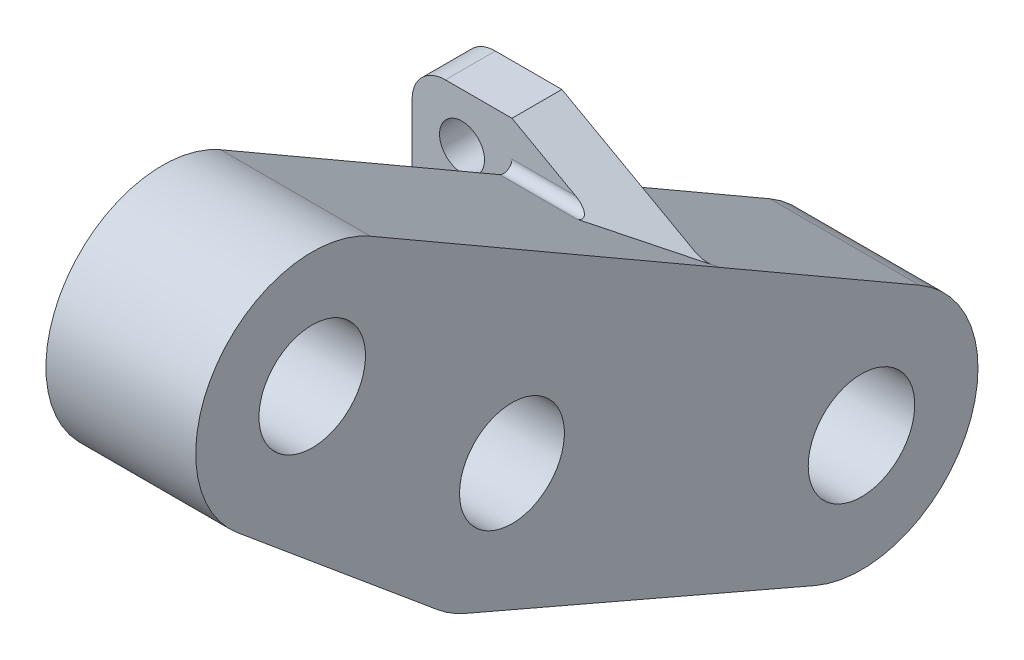
ISO-10303-21;
HEADER;
FILE_DESCRIPTION(('STEP AP214'),'2;1');
FILE_NAME('part.step','',(''),(''),'','','');
FILE_SCHEMA(('AUTOMOTIVE_DESIGN { 1 0 10303 214 1 1 1 1 }'));
ENDSEC;
DATA;
#1=APPLICATION_CONTEXT('core data for automotive mechanical design processes');
#2=APPLICATION_PROTOCOL_DEFINITION('international standard','automotive_design',2000,#1);
#3=PRODUCT_CONTEXT('',#1,'mechanical');
#4=PRODUCT('Part','Part','',(#3));
#5=PRODUCT_RELATED_PRODUCT_CATEGORY('part','',(#4));
#6=PRODUCT_DEFINITION_FORMATION('','',#4);
#7=PRODUCT_DEFINITION_CONTEXT('part definition',#1,'design');
#8=PRODUCT_DEFINITION('design','',#6,#7);
#9=PRODUCT_DEFINITION_SHAPE('','',#8);
#10=(LENGTH_UNIT() NAMED_UNIT(*) SI_UNIT(.MILLI.,.METRE.));
#11=(NAMED_UNIT(*) PLANE_ANGLE_UNIT() SI_UNIT($,.RADIAN.));
#12=(NAMED_UNIT(*) SI_UNIT($,.STERADIAN.) SOLID_ANGLE_UNIT());
#13=UNCERTAINTY_MEASURE_WITH_UNIT(LENGTH_MEASURE(1.E-05),#10,'distance_accuracy_value','');
#14=(GEOMETRIC_REPRESENTATION_CONTEXT(3) GLOBAL_UNCERTAINTY_ASSIGNED_CONTEXT((#13)) GLOBAL_UNIT_ASSIGNED_CONTEXT((#10,
#11,#12)) REPRESENTATION_CONTEXT('',''));
#15=CARTESIAN_POINT('',(0.,0.,0.));
#16=DIRECTION('',(0.,0.,1.));
#17=DIRECTION('',(1.,0.,0.));
#18=AXIS2_PLACEMENT_3D('',#15,#16,#17);
#19=CARTESIAN_POINT('',(0.,220.170630858978,-3.52352146744068));
#20=DIRECTION('',(0.,0.866046289310678,-0.499963823462463));
#21=DIRECTION('',(0.,0.499963823462463,0.866046289310678));
#22=AXIS2_PLACEMENT_3D('',#19,#20,#21);
#23=PLANE('',#22);
#24=DIRECTION('',(-0.668937989077525,0.37163221615418,0.643747980723241));
#25=VECTOR('',#24,1.);
#26=CARTESIAN_POINT('',(11.872490774869,225.512478625542,5.72972290583605));
#27=LINE('',#26,#25);
#28=CARTESIAN_POINT('',(4.60223241258734,229.551511049032,12.7262072085277));
#29=VERTEX_POINT('',#28);
#30=CARTESIAN_POINT('',(8.75875334381253,227.242332753907,8.72620720852774));
#31=VERTEX_POINT('',#30);
#32=EDGE_CURVE('E200',#29,#31,#27,.F.);
#33=ORIENTED_EDGE('',*,*,#32,.F.);
#34=DIRECTION('',(1.,0.,0.));
#35=VECTOR('',#34,1.);
#36=CARTESIAN_POINT('',(0.,229.551511049032,12.7262072085277));
#37=LINE('',#36,#35);
#38=CARTESIAN_POINT('',(0.,229.551511049032,12.7262072085277));
#39=VERTEX_POINT('',#38);
#40=EDGE_CURVE('E220',#29,#39,#37,.F.);
#41=ORIENTED_EDGE('',*,*,#40,.T.);
#42=DIRECTION('',(0.,0.499963823462463,0.866046289310678));
#43=VECTOR('',#42,1.);
#44=CARTESIAN_POINT('',(0.,220.170630858978,-3.52352146744068));
#45=LINE('',#44,#43);
#46=CARTESIAN_POINT('',(0.,239.221811231012,29.4772743779963));
#47=VERTEX_POINT('',#46);
#48=EDGE_CURVE('E285',#39,#47,#45,.T.);
#49=ORIENTED_EDGE('',*,*,#48,.T.);
#50=DIRECTION('',(1.,0.,0.));
#51=VECTOR('',#50,1.);
#52=CARTESIAN_POINT('',(0.,239.221811231012,29.4772743779963));
#53=LINE('',#52,#51);
#54=CARTESIAN_POINT('',(9.,239.221811231012,29.4772743779963));
#55=VERTEX_POINT('',#54);
#56=EDGE_CURVE('E325',#47,#55,#53,.T.);
#57=ORIENTED_EDGE('',*,*,#56,.T.);
#58=DIRECTION('',(0.,0.499963823462463,0.866046289310678));
#59=VECTOR('',#58,1.);
#60=CARTESIAN_POINT('',(9.,220.170630858978,-3.52352146744068));
#61=LINE('',#60,#59);
#62=CARTESIAN_POINT('',(9.,227.108306833803,8.49404510933065));
#63=VERTEX_POINT('',#62);
#64=EDGE_CURVE('E301',#63,#55,#61,.T.);
#65=ORIENTED_EDGE('',*,*,#64,.F.);
#66=EDGE_CURVE('E199',#31,#63,#27,.F.);
#67=ORIENTED_EDGE('',*,*,#66,.F.);
#68=EDGE_LOOP('',(#33,#41,#49,#57,#65,#67));
#69=FACE_BOUND('',#68,.T.);
#70=ADVANCED_FACE('F33',(#69),#23,.T.);
#71=CARTESIAN_POINT('',(0.,214.108306833803,-0.023774703203491));
#72=DIRECTION('',(1.,0.,0.));
#73=DIRECTION('',(0.,0.,-1.));
#74=AXIS2_PLACEMENT_3D('',#71,#72,#73);
#75=PLANE('',#74);
#76=CARTESIAN_POINT('',(0.,233.159487205837,32.9770211422335));
#77=DIRECTION('',(1.,0.,0.));
#78=DIRECTION('',(0.,0.,1.));
#79=AXIS2_PLACEMENT_3D('',#76,#77,#78);
#80=CIRCLE('',#79,3.20000000000002);
#81=CARTESIAN_POINT('',(0.,233.159487205837,36.1770211422335));
#82=VERTEX_POINT('',#81);
#83=EDGE_CURVE('E376',#82,#82,#80,.T.);
#84=ORIENTED_EDGE('',*,*,#83,.T.);
#85=EDGE_LOOP('',(#84));
#86=FACE_BOUND('',#85,.T.);
#87=CARTESIAN_POINT('',(0.,223.159487205837,20.9766034061269));
#88=DIRECTION('',(1.,0.,0.));
#89=DIRECTION('',(0.,0.,1.));
#90=AXIS2_PLACEMENT_3D('',#87,#88,#89);
#91=CIRCLE('',#90,3.15000000000003);
#92=CARTESIAN_POINT('',(0.,223.159487205837,24.1266034061269));
#93=VERTEX_POINT('',#92);
#94=EDGE_CURVE('E370',#93,#93,#91,.T.);
#95=ORIENTED_EDGE('',*,*,#94,.T.);
#96=EDGE_LOOP('',(#95));
#97=FACE_BOUND('',#96,.T.);
#98=ORIENTED_EDGE('',*,*,#48,.F.);
#99=CARTESIAN_POINT('',(0.,229.984534193687,12.4762252967965));
#100=DIRECTION('',(1.,0.,0.));
#101=DIRECTION('',(0.,0.,-1.));
#102=AXIS2_PLACEMENT_3D('',#99,#100,#101);
#103=CIRCLE('',#102,0.5);
#104=CARTESIAN_POINT('',(0.,229.984534193687,11.9762252967965));
#105=VERTEX_POINT('',#104);
#106=EDGE_CURVE('E172',#39,#105,#103,.T.);
#107=ORIENTED_EDGE('',*,*,#106,.T.);
#108=DIRECTION('',(0.,-1.,0.));
#109=VECTOR('',#108,1.);
#110=CARTESIAN_POINT('',(0.,214.108306833803,11.9762252967965));
#111=LINE('',#110,#109);
#112=CARTESIAN_POINT('',(0.,211.657828734491,11.9762252967965));
#113=VERTEX_POINT('',#112);
#114=EDGE_CURVE('E156',#105,#113,#111,.T.);
#115=ORIENTED_EDGE('',*,*,#114,.T.);
#116=DIRECTION('',(0.,-0.39580328417918,-0.918335320148896));
#117=VECTOR('',#116,1.);
#118=CARTESIAN_POINT('',(0.,216.731139964795,23.7472263953811));
#119=LINE('',#118,#117);
#120=CARTESIAN_POINT('',(0.,216.731139964795,23.7472263953811));
#121=VERTEX_POINT('',#120);
#122=EDGE_CURVE('E170',#121,#113,#119,.T.);
#123=ORIENTED_EDGE('',*,*,#122,.F.);
#124=CARTESIAN_POINT('',(0.,223.159487205837,20.9766034061269));
#125=DIRECTION('',(1.,0.,0.));
#126=DIRECTION('',(0.,0.,-1.));
#127=AXIS2_PLACEMENT_3D('',#124,#125,#126);
#128=CIRCLE('',#127,6.99999999999991);
#129=CARTESIAN_POINT('',(0.,217.781861529833,25.4578021395881));
#130=VERTEX_POINT('',#129);
#131=EDGE_CURVE('E296',#130,#121,#128,.T.);
#132=ORIENTED_EDGE('',*,*,#131,.F.);
#133=DIRECTION('',(0.,-0.640171247637326,-0.768232239429243));
#134=VECTOR('',#133,1.);
#135=CARTESIAN_POINT('',(0.,227.781861529833,37.4582198756947));
#136=LINE('',#135,#134);
#137=CARTESIAN_POINT('',(0.,227.781861529833,37.4582198756947));
#138=VERTEX_POINT('',#137);
#139=EDGE_CURVE('E288',#138,#130,#136,.T.);
#140=ORIENTED_EDGE('',*,*,#139,.F.);
#141=CARTESIAN_POINT('',(0.,233.159487205837,32.9770211422335));
#142=DIRECTION('',(1.,0.,0.));
#143=DIRECTION('',(0.,0.,-1.));
#144=AXIS2_PLACEMENT_3D('',#141,#142,#143);
#145=CIRCLE('',#144,6.99999999999992);
#146=EDGE_CURVE('E284',#47,#138,#145,.T.);
#147=ORIENTED_EDGE('',*,*,#146,.F.);
#148=EDGE_LOOP('',(#98,#107,#115,#123,#132,#140,#147));
#149=FACE_BOUND('',#148,.T.);
#150=ADVANCED_FACE('F168',(#86,#97,#149),#75,.F.);
#151=CARTESIAN_POINT('',(0.,214.108306833803,-0.023774703203491));
#152=DIRECTION('',(1.,0.,0.));
#153=DIRECTION('',(0.,0.,-1.));
#154=AXIS2_PLACEMENT_3D('',#151,#152,#153);
#155=CYLINDRICAL_SURFACE('',#154,6.99999999999988);
#156=CARTESIAN_POINT('',(9.,214.108306833803,-0.023774703203491));
#157=DIRECTION('',(1.,0.,0.));
#158=DIRECTION('',(0.,0.,-1.));
#159=AXIS2_PLACEMENT_3D('',#156,#157,#158);
#160=CIRCLE('',#159,6.99999999999988);
#161=CARTESIAN_POINT('',(9.,207.679959592761,2.74684828605071));
#162=VERTEX_POINT('',#161);
#163=CARTESIAN_POINT('',(9.,220.170630858978,-3.52352146744068));
#164=VERTEX_POINT('',#163);
#165=EDGE_CURVE('E298',#162,#164,#160,.T.);
#166=ORIENTED_EDGE('',*,*,#165,.F.);
#167=DIRECTION('',(1.,0.,0.));
#168=VECTOR('',#167,1.);
#169=CARTESIAN_POINT('',(0.,207.679959592761,2.74684828605071));
#170=LINE('',#169,#168);
#171=CARTESIAN_POINT('',(0.,207.679959592761,2.74684828605071));
#172=VERTEX_POINT('',#171);
#173=EDGE_CURVE('E317',#172,#162,#170,.T.);
#174=ORIENTED_EDGE('',*,*,#173,.F.);
#175=CARTESIAN_POINT('',(0.,214.108306833803,-0.023774703203491));
#176=DIRECTION('',(1.,0.,0.));
#177=DIRECTION('',(0.,0.,-1.));
#178=AXIS2_PLACEMENT_3D('',#175,#176,#177);
#179=CIRCLE('',#178,6.99999999999988);
#180=CARTESIAN_POINT('',(0.,220.170630858978,-3.52352146744068));
#181=VERTEX_POINT('',#180);
#182=EDGE_CURVE('E290',#172,#181,#179,.T.);
#183=ORIENTED_EDGE('',*,*,#182,.T.);
#184=DIRECTION('',(1.,0.,0.));
#185=VECTOR('',#184,1.);
#186=CARTESIAN_POINT('',(0.,220.170630858978,-3.52352146744068));
#187=LINE('',#186,#185);
#188=EDGE_CURVE('E181',#181,#164,#187,.T.);
#189=ORIENTED_EDGE('',*,*,#188,.T.);
#190=EDGE_LOOP('',(#166,#174,#183,#189));
#191=FACE_BOUND('',#190,.T.);
#192=ADVANCED_FACE('F257',(#191),#155,.T.);
#193=CARTESIAN_POINT('',(0.,216.731139964795,23.7472263953811));
#194=DIRECTION('',(0.,-0.918335320148896,0.39580328417918));
#195=DIRECTION('',(0.,-0.39580328417918,-0.918335320148896));
#196=AXIS2_PLACEMENT_3D('',#193,#194,#195);
#197=PLANE('',#196);
#198=ORIENTED_EDGE('',*,*,#122,.T.);
#199=DIRECTION('',(0.,-0.39580328417918,-0.918335320148896));
#200=VECTOR('',#199,1.);
#201=CARTESIAN_POINT('',(0.,216.731139964795,23.7472263953811));
#202=LINE('',#201,#200);
#203=CARTESIAN_POINT('',(0.,209.933825418948,7.97622529679652));
#204=VERTEX_POINT('',#203);
#205=EDGE_CURVE('E49',#113,#204,#202,.T.);
#206=ORIENTED_EDGE('',*,*,#205,.T.);
#207=EDGE_CURVE('E182',#204,#172,#119,.T.);
#208=ORIENTED_EDGE('',*,*,#207,.T.);
#209=ORIENTED_EDGE('',*,*,#173,.T.);
#210=DIRECTION('',(0.,-0.39580328417918,-0.918335320148896));
#211=VECTOR('',#210,1.);
#212=CARTESIAN_POINT('',(9.,216.731139964795,23.7472263953811));
#213=LINE('',#212,#211);
#214=CARTESIAN_POINT('',(9.,216.731139964795,23.7472263953811));
#215=VERTEX_POINT('',#214);
#216=EDGE_CURVE('E315',#215,#162,#213,.T.);
#217=ORIENTED_EDGE('',*,*,#216,.F.);
#218=DIRECTION('',(1.,0.,0.));
#219=VECTOR('',#218,1.);
#220=CARTESIAN_POINT('',(0.,216.731139964795,23.7472263953811));
#221=LINE('',#220,#219);
#222=EDGE_CURVE('E179',#121,#215,#221,.T.);
#223=ORIENTED_EDGE('',*,*,#222,.F.);
#224=EDGE_LOOP('',(#198,#206,#208,#209,#217,#223));
#225=FACE_BOUND('',#224,.T.);
#226=ADVANCED_FACE('F177',(#225),#197,.T.);
#227=CARTESIAN_POINT('',(0.,223.159487205837,20.9766034061269));
#228=DIRECTION('',(1.,0.,0.));
#229=DIRECTION('',(0.,0.,-1.));
#230=AXIS2_PLACEMENT_3D('',#227,#228,#229);
#231=CYLINDRICAL_SURFACE('',#230,6.99999999999991);
#232=CARTESIAN_POINT('',(9.,223.159487205837,20.9766034061269));
#233=DIRECTION('',(1.,0.,0.));
#234=DIRECTION('',(0.,0.,-1.));
#235=AXIS2_PLACEMENT_3D('',#232,#233,#234);
#236=CIRCLE('',#235,6.99999999999991);
#237=CARTESIAN_POINT('',(9.,217.781861529833,25.4578021395881));
#238=VERTEX_POINT('',#237);
#239=EDGE_CURVE('E312',#238,#215,#236,.T.);
#240=ORIENTED_EDGE('',*,*,#239,.F.);
#241=DIRECTION('',(1.,0.,0.));
#242=VECTOR('',#241,1.);
#243=CARTESIAN_POINT('',(0.,217.781861529833,25.4578021395881));
#244=LINE('',#243,#242);
#245=EDGE_CURVE('E321',#130,#238,#244,.T.);
#246=ORIENTED_EDGE('',*,*,#245,.F.);
#247=ORIENTED_EDGE('',*,*,#131,.T.);
#248=ORIENTED_EDGE('',*,*,#222,.T.);
#249=EDGE_LOOP('',(#240,#246,#247,#248));
#250=FACE_BOUND('',#249,.T.);
#251=ADVANCED_FACE('F344',(#250),#231,.T.);
#252=CARTESIAN_POINT('',(0.,227.781861529833,37.4582198756947));
#253=DIRECTION('',(0.,-0.768232239429243,0.640171247637326));
#254=DIRECTION('',(0.,-0.640171247637326,-0.768232239429243));
#255=AXIS2_PLACEMENT_3D('',#252,#253,#254);
#256=PLANE('',#255);
#257=DIRECTION('',(0.,-0.640171247637326,-0.768232239429243));
#258=VECTOR('',#257,1.);
#259=CARTESIAN_POINT('',(9.,227.781861529833,37.4582198756947));
#260=LINE('',#259,#258);
#261=CARTESIAN_POINT('',(9.,227.781861529833,37.4582198756947));
#262=VERTEX_POINT('',#261);
#263=EDGE_CURVE('E309',#262,#238,#260,.T.);
#264=ORIENTED_EDGE('',*,*,#263,.F.);
#265=DIRECTION('',(1.,0.,0.));
#266=VECTOR('',#265,1.);
#267=CARTESIAN_POINT('',(0.,227.781861529833,37.4582198756947));
#268=LINE('',#267,#266);
#269=EDGE_CURVE('E323',#138,#262,#268,.T.);
#270=ORIENTED_EDGE('',*,*,#269,.F.);
#271=ORIENTED_EDGE('',*,*,#139,.T.);
#272=ORIENTED_EDGE('',*,*,#245,.T.);
#273=EDGE_LOOP('',(#264,#270,#271,#272));
#274=FACE_BOUND('',#273,.T.);
#275=ADVANCED_FACE('F274',(#274),#256,.T.);
#276=CARTESIAN_POINT('',(0.,233.159487205837,32.9770211422335));
#277=DIRECTION('',(1.,0.,0.));
#278=DIRECTION('',(0.,0.,-1.));
#279=AXIS2_PLACEMENT_3D('',#276,#277,#278);
#280=CYLINDRICAL_SURFACE('',#279,6.99999999999992);
#281=CARTESIAN_POINT('',(9.,233.159487205837,32.9770211422335));
#282=DIRECTION('',(1.,0.,0.));
#283=DIRECTION('',(0.,0.,-1.));
#284=AXIS2_PLACEMENT_3D('',#281,#282,#283);
#285=CIRCLE('',#284,6.99999999999992);
#286=EDGE_CURVE('E306',#55,#262,#285,.T.);
#287=ORIENTED_EDGE('',*,*,#286,.F.);
#288=ORIENTED_EDGE('',*,*,#56,.F.);
#289=ORIENTED_EDGE('',*,*,#146,.T.);
#290=ORIENTED_EDGE('',*,*,#269,.T.);
#291=EDGE_LOOP('',(#287,#288,#289,#290));
#292=FACE_BOUND('',#291,.T.);
#293=ADVANCED_FACE('F264',(#292),#280,.T.);
#294=CARTESIAN_POINT('',(0.,226.80937226583,7.97622529679651));
#295=VERTEX_POINT('',#294);
#296=EDGE_CURVE('E278',#181,#295,#45,.T.);
#297=ORIENTED_EDGE('',*,*,#296,.T.);
#298=CARTESIAN_POINT('',(-1.,226.80937226583,7.97622529679651));
#299=DIRECTION('',(0.,0.866046289310678,-0.499963823462463));
#300=DIRECTION('',(0.,0.499963823462463,0.866046289310678));
#301=AXIS2_PLACEMENT_3D('',#298,#299,#300);
#302=ELLIPSE('',#301,1.1546726916825,1.);
#303=CARTESIAN_POINT('',(-0.338541662630233,227.242332753907,8.72620720852774));
#304=VERTEX_POINT('',#303);
#305=EDGE_CURVE('E231',#295,#304,#302,.F.);
#306=ORIENTED_EDGE('',*,*,#305,.T.);
#307=DIRECTION('',(-1.,0.,0.));
#308=VECTOR('',#307,1.);
#309=CARTESIAN_POINT('',(8.49895198954403,227.242332753907,8.72620720852774));
#310=LINE('',#309,#308);
#311=EDGE_CURVE('E57',#304,#31,#310,.F.);
#312=ORIENTED_EDGE('',*,*,#311,.T.);
#313=ORIENTED_EDGE('',*,*,#66,.T.);
#314=EDGE_CURVE('E303',#164,#63,#61,.T.);
#315=ORIENTED_EDGE('',*,*,#314,.F.);
#316=ORIENTED_EDGE('',*,*,#188,.F.);
#317=EDGE_LOOP('',(#297,#306,#312,#313,#315,#316));
#318=FACE_BOUND('',#317,.T.);
#319=ADVANCED_FACE('F252',(#318),#23,.T.);
#320=CARTESIAN_POINT('',(0.,214.108306833803,-0.023774703203491));
#321=DIRECTION('',(1.,0.,0.));
#322=DIRECTION('',(0.,0.,1.));
#323=AXIS2_PLACEMENT_3D('',#320,#321,#322);
#324=CIRCLE('',#323,3.20000000000001);
#325=CARTESIAN_POINT('',(0.,214.108306833803,3.17622529679652));
#326=VERTEX_POINT('',#325);
#327=EDGE_CURVE('E302',#326,#326,#324,.T.);
#328=ORIENTED_EDGE('',*,*,#327,.T.);
#329=EDGE_LOOP('',(#328));
#330=FACE_BOUND('',#329,.T.);
#331=ORIENTED_EDGE('',*,*,#207,.F.);
#332=DIRECTION('',(0.,1.,0.));
#333=VECTOR('',#332,1.);
#334=CARTESIAN_POINT('',(0.,214.108306833803,7.97622529679651));
#335=LINE('',#334,#333);
#336=EDGE_CURVE('E226',#204,#295,#335,.T.);
#337=ORIENTED_EDGE('',*,*,#336,.T.);
#338=ORIENTED_EDGE('',*,*,#296,.F.);
#339=ORIENTED_EDGE('',*,*,#182,.F.);
#340=EDGE_LOOP('',(#331,#337,#338,#339));
#341=FACE_BOUND('',#340,.T.);
#342=ADVANCED_FACE('F260',(#330,#341),#75,.F.);
#343=CARTESIAN_POINT('',(9.,214.108306833803,-0.023774703203491));
#344=DIRECTION('',(1.,0.,0.));
#345=DIRECTION('',(0.,0.,-1.));
#346=AXIS2_PLACEMENT_3D('',#343,#344,#345);
#347=PLANE('',#346);
#348=ORIENTED_EDGE('',*,*,#314,.T.);
#349=ORIENTED_EDGE('',*,*,#64,.T.);
#350=ORIENTED_EDGE('',*,*,#286,.T.);
#351=ORIENTED_EDGE('',*,*,#263,.T.);
#352=ORIENTED_EDGE('',*,*,#239,.T.);
#353=ORIENTED_EDGE('',*,*,#216,.T.);
#354=ORIENTED_EDGE('',*,*,#165,.T.);
#355=EDGE_LOOP('',(#348,#349,#350,#351,#352,#353,#354));
#356=FACE_BOUND('',#355,.T.);
#357=CARTESIAN_POINT('',(9.,214.108306833803,-0.023774703203491));
#358=DIRECTION('',(1.,0.,0.));
#359=DIRECTION('',(0.,0.,1.));
#360=AXIS2_PLACEMENT_3D('',#357,#358,#359);
#361=CIRCLE('',#360,3.20000000000001);
#362=CARTESIAN_POINT('',(9.,214.108306833803,3.17622529679652));
#363=VERTEX_POINT('',#362);
#364=EDGE_CURVE('E379',#363,#363,#361,.T.);
#365=ORIENTED_EDGE('',*,*,#364,.F.);
#366=EDGE_LOOP('',(#365));
#367=FACE_BOUND('',#366,.T.);
#368=CARTESIAN_POINT('',(9.,233.159487205837,32.9770211422335));
#369=DIRECTION('',(1.,0.,0.));
#370=DIRECTION('',(0.,0.,1.));
#371=AXIS2_PLACEMENT_3D('',#368,#369,#370);
#372=CIRCLE('',#371,3.20000000000002);
#373=CARTESIAN_POINT('',(9.,233.159487205837,36.1770211422335));
#374=VERTEX_POINT('',#373);
#375=EDGE_CURVE('E373',#374,#374,#372,.T.);
#376=ORIENTED_EDGE('',*,*,#375,.F.);
#377=EDGE_LOOP('',(#376));
#378=FACE_BOUND('',#377,.T.);
#379=CARTESIAN_POINT('',(9.,223.159487205837,20.9766034061269));
#380=DIRECTION('',(1.,0.,0.));
#381=DIRECTION('',(0.,0.,1.));
#382=AXIS2_PLACEMENT_3D('',#379,#380,#381);
#383=CIRCLE('',#382,3.15000000000003);
#384=CARTESIAN_POINT('',(9.,223.159487205837,24.1266034061269));
#385=VERTEX_POINT('',#384);
#386=EDGE_CURVE('E174',#385,#385,#383,.T.);
#387=ORIENTED_EDGE('',*,*,#386,.F.);
#388=EDGE_LOOP('',(#387));
#389=FACE_BOUND('',#388,.T.);
#390=ADVANCED_FACE('F271',(#356,#367,#378,#389),#347,.T.);
#391=CARTESIAN_POINT('',(0.,214.108306833803,-0.023774703203491));
#392=DIRECTION('',(1.,0.,0.));
#393=DIRECTION('',(0.,0.,-1.));
#394=AXIS2_PLACEMENT_3D('',#391,#392,#393);
#395=CYLINDRICAL_SURFACE('',#394,3.20000000000001);
#396=ORIENTED_EDGE('',*,*,#327,.F.);
#397=EDGE_LOOP('',(#396));
#398=FACE_BOUND('',#397,.T.);
#399=ORIENTED_EDGE('',*,*,#364,.T.);
#400=EDGE_LOOP('',(#399));
#401=FACE_BOUND('',#400,.T.);
#402=ADVANCED_FACE('F386',(#398,#401),#395,.F.);
#403=CARTESIAN_POINT('',(0.,233.159487205837,32.9770211422335));
#404=DIRECTION('',(1.,0.,0.));
#405=DIRECTION('',(0.,0.,-1.));
#406=AXIS2_PLACEMENT_3D('',#403,#404,#405);
#407=CYLINDRICAL_SURFACE('',#406,3.20000000000002);
#408=ORIENTED_EDGE('',*,*,#83,.F.);
#409=EDGE_LOOP('',(#408));
#410=FACE_BOUND('',#409,.T.);
#411=ORIENTED_EDGE('',*,*,#375,.T.);
#412=EDGE_LOOP('',(#411));
#413=FACE_BOUND('',#412,.T.);
#414=ADVANCED_FACE('F395',(#410,#413),#407,.F.);
#415=CARTESIAN_POINT('',(0.,223.159487205837,20.9766034061269));
#416=DIRECTION('',(1.,0.,0.));
#417=DIRECTION('',(0.,0.,-1.));
#418=AXIS2_PLACEMENT_3D('',#415,#416,#417);
#419=CYLINDRICAL_SURFACE('',#418,3.15000000000003);
#420=ORIENTED_EDGE('',*,*,#94,.F.);
#421=EDGE_LOOP('',(#420));
#422=FACE_BOUND('',#421,.T.);
#423=ORIENTED_EDGE('',*,*,#386,.T.);
#424=EDGE_LOOP('',(#423));
#425=FACE_BOUND('',#424,.T.);
#426=ADVANCED_FACE('F394',(#422,#425),#419,.F.);
#427=CARTESIAN_POINT('',(30.9494635012435,232.108306833803,11.9762252967965));
#428=DIRECTION('',(0.,0.,1.));
#429=DIRECTION('',(0.,-1.,0.));
#430=AXIS2_PLACEMENT_3D('',#427,#428,#429);
#431=PLANE('',#430);
#432=CARTESIAN_POINT('',(-3.,229.108306833803,11.9762252967965));
#433=DIRECTION('',(0.,0.,1.));
#434=DIRECTION('',(0.,-1.,0.));
#435=AXIS2_PLACEMENT_3D('',#432,#433,#434);
#436=CIRCLE('',#435,1.34999999999999);
#437=CARTESIAN_POINT('',(-3.,227.758306833803,11.9762252967965));
#438=VERTEX_POINT('',#437);
#439=EDGE_CURVE('E573',#438,#438,#436,.T.);
#440=ORIENTED_EDGE('',*,*,#439,.F.);
#441=EDGE_LOOP('',(#440));
#442=FACE_BOUND('',#441,.T.);
#443=ORIENTED_EDGE('',*,*,#114,.F.);
#444=DIRECTION('',(1.,0.,0.));
#445=VECTOR('',#444,1.);
#446=CARTESIAN_POINT('',(5.38156129112513,229.984534193687,11.9762252967965));
#447=LINE('',#446,#445);
#448=CARTESIAN_POINT('',(3.8227907522077,229.984534193687,11.9762252967965));
#449=VERTEX_POINT('',#448);
#450=EDGE_CURVE('E218',#105,#449,#447,.T.);
#451=ORIENTED_EDGE('',*,*,#450,.T.);
#452=DIRECTION('',(0.874157276121538,-0.485642931178632,0.));
#453=VECTOR('',#452,1.);
#454=CARTESIAN_POINT('',(23.6500617320823,218.969383649313,11.9762252967965));
#455=LINE('',#454,#453);
#456=CARTESIAN_POINT('',(0.,232.108306833803,11.9762252967965));
#457=VERTEX_POINT('',#456);
#458=EDGE_CURVE('E202',#449,#457,#455,.F.);
#459=ORIENTED_EDGE('',*,*,#458,.T.);
#460=DIRECTION('',(-1.,0.,0.));
#461=VECTOR('',#460,1.);
#462=CARTESIAN_POINT('',(30.9494635012435,232.108306833803,11.9762252967965));
#463=LINE('',#462,#461);
#464=CARTESIAN_POINT('',(-4.,232.108306833803,11.9762252967965));
#465=VERTEX_POINT('',#464);
#466=EDGE_CURVE('E362',#457,#465,#463,.T.);
#467=ORIENTED_EDGE('',*,*,#466,.T.);
#468=CARTESIAN_POINT('',(-4.,230.108306833803,11.9762252967965));
#469=DIRECTION('',(0.,0.,1.));
#470=DIRECTION('',(0.,-1.,0.));
#471=AXIS2_PLACEMENT_3D('',#468,#469,#470);
#472=CIRCLE('',#471,2.);
#473=CARTESIAN_POINT('',(-6.,230.108306833803,11.9762252967965));
#474=VERTEX_POINT('',#473);
#475=EDGE_CURVE('E211',#465,#474,#472,.T.);
#476=ORIENTED_EDGE('',*,*,#475,.T.);
#477=DIRECTION('',(0.,1.,0.));
#478=VECTOR('',#477,1.);
#479=CARTESIAN_POINT('',(-6.,232.108306833803,11.9762252967965));
#480=LINE('',#479,#478);
#481=CARTESIAN_POINT('',(-5.99999999999999,222.547097371549,11.9762252967965));
#482=VERTEX_POINT('',#481);
#483=EDGE_CURVE('E159',#482,#474,#480,.T.);
#484=ORIENTED_EDGE('',*,*,#483,.F.);
#485=DIRECTION('',(-0.482591843188045,0.875845370421266,0.));
#486=VECTOR('',#485,1.);
#487=CARTESIAN_POINT('',(-1.43595103016961,214.263904820687,11.9762252967965));
#488=LINE('',#487,#486);
#489=EDGE_CURVE('E152',#482,#113,#488,.F.);
#490=ORIENTED_EDGE('',*,*,#489,.T.);
#491=EDGE_LOOP('',(#443,#451,#459,#467,#476,#484,#490));
#492=FACE_BOUND('',#491,.T.);
#493=ADVANCED_FACE('F154',(#442,#492),#431,.T.);
#494=CARTESIAN_POINT('',(30.9494635012435,232.108306833803,8.97622529679651));
#495=DIRECTION('',(0.,1.,0.));
#496=DIRECTION('',(0.,0.,1.));
#497=AXIS2_PLACEMENT_3D('',#494,#495,#496);
#498=PLANE('',#497);
#499=DIRECTION('',(-1.,0.,0.));
#500=VECTOR('',#499,1.);
#501=CARTESIAN_POINT('',(30.9494635012435,232.108306833803,8.97622529679651));
#502=LINE('',#501,#500);
#503=CARTESIAN_POINT('',(0.,232.108306833803,8.97622529679651));
#504=VERTEX_POINT('',#503);
#505=CARTESIAN_POINT('',(-4.,232.108306833803,8.97622529679651));
#506=VERTEX_POINT('',#505);
#507=EDGE_CURVE('E175',#504,#506,#502,.T.);
#508=ORIENTED_EDGE('',*,*,#507,.T.);
#509=DIRECTION('',(0.,0.,-1.));
#510=VECTOR('',#509,1.);
#511=CARTESIAN_POINT('',(-4.,232.108306833803,8.97622529679651));
#512=LINE('',#511,#510);
#513=EDGE_CURVE('E209',#506,#465,#512,.F.);
#514=ORIENTED_EDGE('',*,*,#513,.T.);
#515=ORIENTED_EDGE('',*,*,#466,.F.);
#516=DIRECTION('',(0.,0.,-1.));
#517=VECTOR('',#516,1.);
#518=CARTESIAN_POINT('',(0.,232.108306833803,8.97622529679651));
#519=LINE('',#518,#517);
#520=EDGE_CURVE('E190',#457,#504,#519,.T.);
#521=ORIENTED_EDGE('',*,*,#520,.T.);
#522=EDGE_LOOP('',(#508,#514,#515,#521));
#523=FACE_BOUND('',#522,.T.);
#524=ADVANCED_FACE('F360',(#523),#498,.T.);
#525=CARTESIAN_POINT('',(30.9494635012435,232.108306833803,8.97622529679651));
#526=DIRECTION('',(0.,0.,-1.));
#527=DIRECTION('',(0.,1.,0.));
#528=AXIS2_PLACEMENT_3D('',#525,#526,#527);
#529=PLANE('',#528);
#530=CARTESIAN_POINT('',(-3.,229.108306833803,8.97622529679651));
#531=DIRECTION('',(0.,0.,-1.));
#532=DIRECTION('',(0.,1.,0.));
#533=AXIS2_PLACEMENT_3D('',#530,#531,#532);
#534=CIRCLE('',#533,1.34999999999999);
#535=CARTESIAN_POINT('',(-3.,230.458306833803,8.97622529679651));
#536=VERTEX_POINT('',#535);
#537=EDGE_CURVE('E571',#536,#536,#534,.T.);
#538=ORIENTED_EDGE('',*,*,#537,.F.);
#539=EDGE_LOOP('',(#538));
#540=FACE_BOUND('',#539,.T.);
#541=DIRECTION('',(-1.,0.,0.));
#542=VECTOR('',#541,1.);
#543=CARTESIAN_POINT('',(0.,227.675355898562,8.97622529679651));
#544=LINE('',#543,#542);
#545=CARTESIAN_POINT('',(7.9793116834329,227.675355898562,8.97622529679651));
#546=VERTEX_POINT('',#545);
#547=CARTESIAN_POINT('',(-1.,227.675355898562,8.97622529679651));
#548=VERTEX_POINT('',#547);
#549=EDGE_CURVE('E213',#546,#548,#544,.T.);
#550=ORIENTED_EDGE('',*,*,#549,.T.);
#551=DIRECTION('',(0.,1.,0.));
#552=VECTOR('',#551,1.);
#553=CARTESIAN_POINT('',(-1.,232.108306833803,8.97622529679651));
#554=LINE('',#553,#552);
#555=CARTESIAN_POINT('',(-0.999999999999995,212.17970435401,8.97622529679651));
#556=VERTEX_POINT('',#555);
#557=EDGE_CURVE('E229',#548,#556,#554,.F.);
#558=ORIENTED_EDGE('',*,*,#557,.T.);
#559=DIRECTION('',(0.482591843188045,-0.875845370421266,0.));
#560=VECTOR('',#559,1.);
#561=CARTESIAN_POINT('',(-1.98247193155495,213.962771152522,8.97622529679651));
#562=LINE('',#561,#560);
#563=CARTESIAN_POINT('',(-5.99999999999999,221.254094884892,8.97622529679651));
#564=VERTEX_POINT('',#563);
#565=EDGE_CURVE('E188',#556,#564,#562,.F.);
#566=ORIENTED_EDGE('',*,*,#565,.T.);
#567=DIRECTION('',(0.,-1.,0.));
#568=VECTOR('',#567,1.);
#569=CARTESIAN_POINT('',(-6.,232.108306833803,8.97622529679651));
#570=LINE('',#569,#568);
#571=CARTESIAN_POINT('',(-6.,230.108306833803,8.97622529679651));
#572=VERTEX_POINT('',#571);
#573=EDGE_CURVE('E333',#572,#564,#570,.T.);
#574=ORIENTED_EDGE('',*,*,#573,.F.);
#575=CARTESIAN_POINT('',(-4.,230.108306833803,8.97622529679651));
#576=DIRECTION('',(0.,0.,-1.));
#577=DIRECTION('',(0.,1.,0.));
#578=AXIS2_PLACEMENT_3D('',#575,#576,#577);
#579=CIRCLE('',#578,2.);
#580=EDGE_CURVE('E207',#572,#506,#579,.T.);
#581=ORIENTED_EDGE('',*,*,#580,.T.);
#582=ORIENTED_EDGE('',*,*,#507,.F.);
#583=DIRECTION('',(-0.874157276121538,0.485642931178632,0.));
#584=VECTOR('',#583,1.);
#585=CARTESIAN_POINT('',(23.6500617320823,218.969383649313,8.97622529679651));
#586=LINE('',#585,#584);
#587=EDGE_CURVE('E196',#504,#546,#586,.F.);
#588=ORIENTED_EDGE('',*,*,#587,.T.);
#589=EDGE_LOOP('',(#550,#558,#566,#574,#581,#582,#588));
#590=FACE_BOUND('',#589,.T.);
#591=ADVANCED_FACE('F363',(#540,#590),#529,.T.);
#592=CARTESIAN_POINT('',(-6.,232.108306833803,8.97622529679651));
#593=DIRECTION('',(-1.,0.,0.));
#594=DIRECTION('',(0.,0.,1.));
#595=AXIS2_PLACEMENT_3D('',#592,#593,#594);
#596=PLANE('',#595);
#597=ORIENTED_EDGE('',*,*,#483,.T.);
#598=DIRECTION('',(0.,0.,-1.));
#599=VECTOR('',#598,1.);
#600=CARTESIAN_POINT('',(-6.,230.108306833803,8.97622529679651));
#601=LINE('',#600,#599);
#602=EDGE_CURVE('E204',#474,#572,#601,.T.);
#603=ORIENTED_EDGE('',*,*,#602,.T.);
#604=ORIENTED_EDGE('',*,*,#573,.T.);
#605=DIRECTION('',(0.,0.39580328417918,0.918335320148896));
#606=VECTOR('',#605,1.);
#607=CARTESIAN_POINT('',(-6.,222.95451833129,12.9215157288238));
#608=LINE('',#607,#606);
#609=EDGE_CURVE('E163',#564,#482,#608,.T.);
#610=ORIENTED_EDGE('',*,*,#609,.T.);
#611=EDGE_LOOP('',(#597,#603,#604,#610));
#612=FACE_BOUND('',#611,.T.);
#613=ADVANCED_FACE('F330',(#612),#596,.T.);
#614=CARTESIAN_POINT('',(-3.,229.108306833803,39.9770211422334));
#615=DIRECTION('',(0.,0.,-1.));
#616=DIRECTION('',(0.,1.,0.));
#617=AXIS2_PLACEMENT_3D('',#614,#615,#616);
#618=CYLINDRICAL_SURFACE('',#617,1.34999999999999);
#619=ORIENTED_EDGE('',*,*,#439,.T.);
#620=EDGE_LOOP('',(#619));
#621=FACE_BOUND('',#620,.T.);
#622=ORIENTED_EDGE('',*,*,#537,.T.);
#623=EDGE_LOOP('',(#622));
#624=FACE_BOUND('',#623,.T.);
#625=ADVANCED_FACE('F449',(#621,#624),#618,.F.);
#626=CARTESIAN_POINT('',(-6.,222.95451833129,12.9215157288238));
#627=DIRECTION('',(0.857492925712544,0.472479624275786,-0.203639109694463));
#628=DIRECTION('',(-0.482591843188045,0.875845370421266,0.));
#629=AXIS2_PLACEMENT_3D('',#626,#627,#628);
#630=PLANE('',#629);
#631=ORIENTED_EDGE('',*,*,#565,.F.);
#632=CARTESIAN_POINT('',(-1.,211.748703525124,7.97622529679651));
#633=DIRECTION('',(0.857492925712544,0.472479624275786,-0.203639109694463));
#634=DIRECTION('',(-0.459694559172936,0.881341593619757,0.109169169743969));
#635=AXIS2_PLACEMENT_3D('',#632,#633,#634);
#636=ELLIPSE('',#635,2.11649338642443,1.);
#637=EDGE_CURVE('E11',#556,#204,#636,.T.);
#638=ORIENTED_EDGE('',*,*,#637,.T.);
#639=ORIENTED_EDGE('',*,*,#205,.F.);
#640=ORIENTED_EDGE('',*,*,#489,.F.);
#641=ORIENTED_EDGE('',*,*,#609,.F.);
#642=EDGE_LOOP('',(#631,#638,#639,#640,#641));
#643=FACE_BOUND('',#642,.T.);
#644=ADVANCED_FACE('F185',(#643),#630,.F.);
#645=CARTESIAN_POINT('',(0.,232.108306833803,8.97622529679651));
#646=DIRECTION('',(-0.485642931178632,-0.874157276121538,0.));
#647=DIRECTION('',(0.874157276121538,-0.485642931178632,0.));
#648=AXIS2_PLACEMENT_3D('',#645,#646,#647);
#649=PLANE('',#648);
#650=ORIENTED_EDGE('',*,*,#458,.F.);
#651=CARTESIAN_POINT('',(3.82279075220772,229.984534193687,12.4762252967965));
#652=DIRECTION('',(-0.485642931178632,-0.874157276121538,0.));
#653=DIRECTION('',(-0.874157276121538,0.485642931178632,0.));
#654=AXIS2_PLACEMENT_3D('',#651,#652,#653);
#655=ELLIPSE('',#654,1.0295630140987,0.5);
#656=EDGE_CURVE('E222',#449,#29,#655,.T.);
#657=ORIENTED_EDGE('',*,*,#656,.T.);
#658=ORIENTED_EDGE('',*,*,#32,.T.);
#659=CARTESIAN_POINT('',(7.97931168343292,227.675355898562,8.47622529679651));
#660=DIRECTION('',(-0.485642931178632,-0.874157276121538,0.));
#661=DIRECTION('',(0.874157276121538,-0.485642931178632,0.));
#662=AXIS2_PLACEMENT_3D('',#659,#660,#661);
#663=ELLIPSE('',#662,1.0295630140987,0.5);
#664=EDGE_CURVE('E216',#31,#546,#663,.T.);
#665=ORIENTED_EDGE('',*,*,#664,.T.);
#666=ORIENTED_EDGE('',*,*,#587,.F.);
#667=ORIENTED_EDGE('',*,*,#520,.F.);
#668=EDGE_LOOP('',(#650,#657,#658,#665,#666,#667));
#669=FACE_BOUND('',#668,.T.);
#670=ADVANCED_FACE('F356',(#669),#649,.F.);
#671=CARTESIAN_POINT('',(-4.,230.108306833803,8.97622529679651));
#672=DIRECTION('',(0.,0.,-1.));
#673=DIRECTION('',(-1.,0.,0.));
#674=AXIS2_PLACEMENT_3D('',#671,#672,#673);
#675=CYLINDRICAL_SURFACE('',#674,2.);
#676=ORIENTED_EDGE('',*,*,#475,.F.);
#677=ORIENTED_EDGE('',*,*,#513,.F.);
#678=ORIENTED_EDGE('',*,*,#580,.F.);
#679=ORIENTED_EDGE('',*,*,#602,.F.);
#680=EDGE_LOOP('',(#676,#677,#678,#679));
#681=FACE_BOUND('',#680,.T.);
#682=ADVANCED_FACE('F241',(#681),#675,.T.);
#683=CARTESIAN_POINT('',(30.9494635012435,227.675355898562,8.47622529679651));
#684=DIRECTION('',(1.,0.,0.));
#685=DIRECTION('',(0.,0.,-1.));
#686=AXIS2_PLACEMENT_3D('',#683,#684,#685);
#687=CYLINDRICAL_SURFACE('',#686,0.5);
#688=ORIENTED_EDGE('',*,*,#664,.F.);
#689=ORIENTED_EDGE('',*,*,#311,.F.);
#690=CARTESIAN_POINT('',(-0.338541662630233,227.242332753907,8.72620720852773));
#691=CARTESIAN_POINT('',(-0.358435268098364,227.252468967107,8.74374949626628));
#692=CARTESIAN_POINT('',(-0.378764839851872,227.263421085917,8.76027597268764));
#693=CARTESIAN_POINT('',(-0.420113337581805,227.286659919372,8.79133263897332));
#694=CARTESIAN_POINT('',(-0.441131058569939,227.298944380004,8.80586610903289));
#695=CARTESIAN_POINT('',(-0.504925896740642,227.337335419573,8.84653603426849));
#696=CARTESIAN_POINT('',(-0.548557669681488,227.365039502697,8.8698394278676));
#697=CARTESIAN_POINT('',(-0.65803044879258,227.436744298893,8.91864647787028));
#698=CARTESIAN_POINT('',(-0.724671878558442,227.482284773633,8.94003689717714));
#699=CARTESIAN_POINT('',(-0.859191205355604,227.575806113459,8.96864222957045));
#700=CARTESIAN_POINT('',(-0.927068624418562,227.623786047529,8.97586250962363));
#701=CARTESIAN_POINT('',(-0.996557419362215,227.672921628244,8.97622084004234));
#702=CARTESIAN_POINT('',(-0.998278751246903,227.674138793832,8.9762252833852));
#703=CARTESIAN_POINT('',(-1.00000000000003,227.675355898562,8.97622529679651));
#704=B_SPLINE_CURVE_WITH_KNOTS('',3,(#690,#691,#692,#693,#694,#695,#696,#697,#698,#699,#700,
#701,#702,#703),.UNSPECIFIED.,.F.,.F.,(4,2,2,2,2,2,4),(0.,0.0851010185635383,0.170060247781907,
0.339502536834418,0.588579614372455,0.837562335281379,0.843886904657637),.UNSPECIFIED.);
#705=EDGE_CURVE('E42',#304,#548,#704,.T.);
#706=ORIENTED_EDGE('',*,*,#705,.T.);
#707=ORIENTED_EDGE('',*,*,#549,.F.);
#708=EDGE_LOOP('',(#688,#689,#706,#707));
#709=FACE_BOUND('',#708,.T.);
#710=ADVANCED_FACE('F236',(#709),#687,.F.);
#711=CARTESIAN_POINT('',(30.9494635012435,229.984534193687,12.4762252967965));
#712=DIRECTION('',(-1.,0.,0.));
#713=DIRECTION('',(0.,0.,1.));
#714=AXIS2_PLACEMENT_3D('',#711,#712,#713);
#715=CYLINDRICAL_SURFACE('',#714,0.5);
#716=ORIENTED_EDGE('',*,*,#106,.F.);
#717=ORIENTED_EDGE('',*,*,#40,.F.);
#718=ORIENTED_EDGE('',*,*,#656,.F.);
#719=ORIENTED_EDGE('',*,*,#450,.F.);
#720=EDGE_LOOP('',(#716,#717,#718,#719));
#721=FACE_BOUND('',#720,.T.);
#722=ADVANCED_FACE('F240',(#721),#715,.F.);
#723=CARTESIAN_POINT('',(-1.,214.108306833803,7.97622529679651));
#724=DIRECTION('',(0.,1.,0.));
#725=DIRECTION('',(0.,0.,1.));
#726=AXIS2_PLACEMENT_3D('',#723,#724,#725);
#727=CYLINDRICAL_SURFACE('',#726,1.);
#728=ORIENTED_EDGE('',*,*,#637,.F.);
#729=ORIENTED_EDGE('',*,*,#557,.F.);
#730=ORIENTED_EDGE('',*,*,#705,.F.);
#731=ORIENTED_EDGE('',*,*,#305,.F.);
#732=ORIENTED_EDGE('',*,*,#336,.F.);
#733=EDGE_LOOP('',(#728,#729,#730,#731,#732));
#734=FACE_BOUND('',#733,.T.);
#735=ADVANCED_FACE('F35',(#734),#727,.F.);
#736=CLOSED_SHELL('',(#70,#150,#192,#226,#251,#275,#293,#319,#342,#390,#402,#414,#426,#493,#524,
#591,#613,#625,#644,#670,#682,#710,#722,#735));
#737=MANIFOLD_SOLID_BREP('B2',#736);
#738=ADVANCED_BREP_SHAPE_REPRESENTATION('',(#18,#737),#14);
#739=SHAPE_DEFINITION_REPRESENTATION(#9,#738);
ENDSEC;
END-ISO-10303-21;
